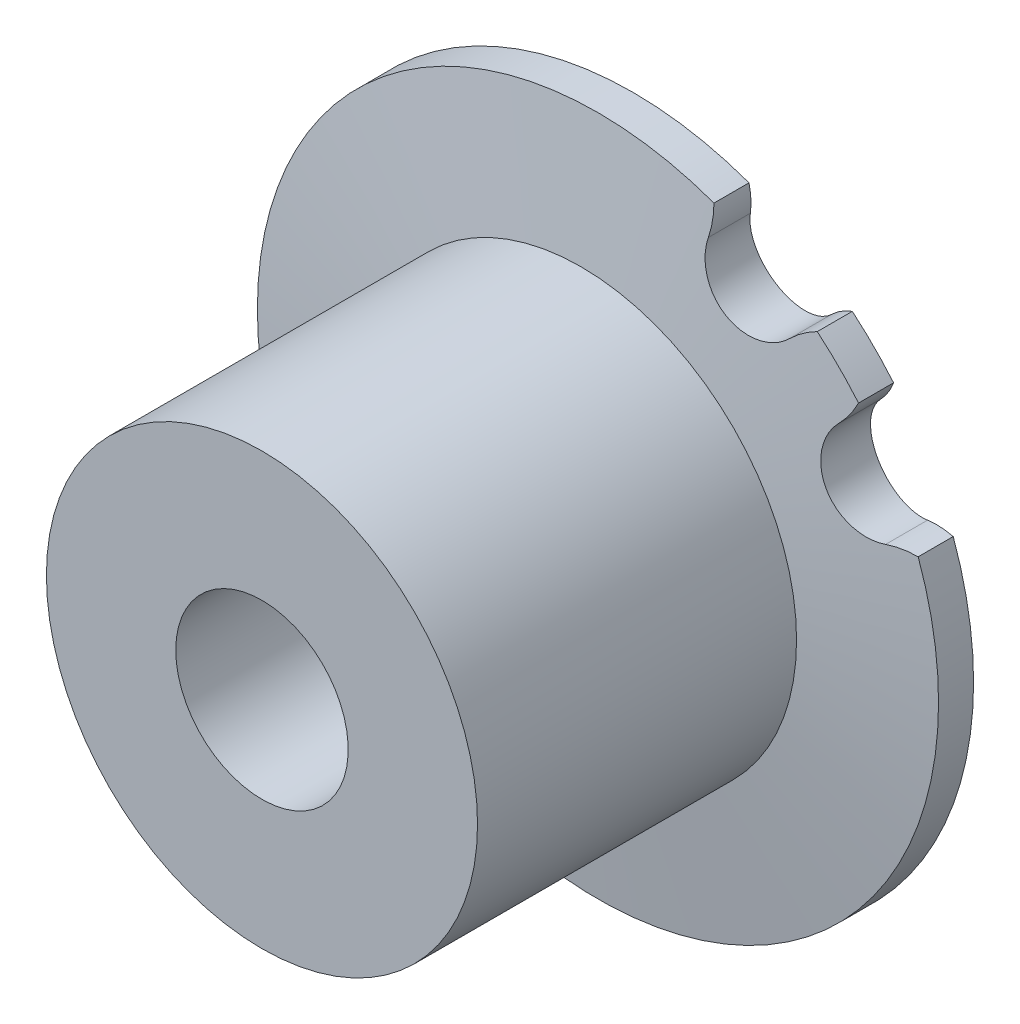
ISO-10303-21;
HEADER;
FILE_DESCRIPTION(('STEP AP214'),'2;1');
FILE_NAME('part.step','',(''),(''),'','','');
FILE_SCHEMA(('AUTOMOTIVE_DESIGN { 1 0 10303 214 1 1 1 1 }'));
ENDSEC;
DATA;
#1=APPLICATION_CONTEXT('core data for automotive mechanical design processes');
#2=APPLICATION_PROTOCOL_DEFINITION('international standard','automotive_design',2000,#1);
#3=PRODUCT_CONTEXT('',#1,'mechanical');
#4=PRODUCT('Part','Part','',(#3));
#5=PRODUCT_RELATED_PRODUCT_CATEGORY('part','',(#4));
#6=PRODUCT_DEFINITION_FORMATION('','',#4);
#7=PRODUCT_DEFINITION_CONTEXT('part definition',#1,'design');
#8=PRODUCT_DEFINITION('design','',#6,#7);
#9=PRODUCT_DEFINITION_SHAPE('','',#8);
#10=(LENGTH_UNIT() NAMED_UNIT(*) SI_UNIT(.MILLI.,.METRE.));
#11=(NAMED_UNIT(*) PLANE_ANGLE_UNIT() SI_UNIT($,.RADIAN.));
#12=(NAMED_UNIT(*) SI_UNIT($,.STERADIAN.) SOLID_ANGLE_UNIT());
#13=UNCERTAINTY_MEASURE_WITH_UNIT(LENGTH_MEASURE(1.E-05),#10,'distance_accuracy_value','');
#14=(GEOMETRIC_REPRESENTATION_CONTEXT(3) GLOBAL_UNCERTAINTY_ASSIGNED_CONTEXT((#13)) GLOBAL_UNIT_ASSIGNED_CONTEXT((#10,
#11,#12)) REPRESENTATION_CONTEXT('',''));
#15=CARTESIAN_POINT('',(0.,0.,0.));
#16=DIRECTION('',(0.,0.,1.));
#17=DIRECTION('',(1.,0.,0.));
#18=AXIS2_PLACEMENT_3D('',#15,#16,#17);
#19=CARTESIAN_POINT('',(0.,0.,-0.406300000015847));
#20=DIRECTION('',(0.,0.,1.));
#21=DIRECTION('',(1.,0.,0.));
#22=AXIS2_PLACEMENT_3D('',#19,#20,#21);
#23=CONICAL_SURFACE('',#22,7.89999999989277,1.44742606851384);
#24=CARTESIAN_POINT('',(0.,0.,-0.799999999998249));
#25=DIRECTION('',(0.,0.,1.));
#26=DIRECTION('',(1.,0.,0.));
#27=AXIS2_PLACEMENT_3D('',#24,#25,#26);
#28=CIRCLE('',#27,4.72500000000764);
#29=CARTESIAN_POINT('',(4.72500000000764,0.,-0.799999999998249));
#30=VERTEX_POINT('',#29);
#31=EDGE_CURVE('E20',#30,#30,#28,.F.);
#32=ORIENTED_EDGE('',*,*,#31,.F.);
#33=EDGE_LOOP('',(#32));
#34=FACE_BOUND('',#33,.T.);
#35=CARTESIAN_POINT('',(5.6633878781362,4.52642659741511,-0.486900000001804));
#36=CARTESIAN_POINT('',(5.70323999846953,4.5671311185864,-0.479888063827677));
#37=CARTESIAN_POINT('',(5.74126707334079,4.60962740082457,-0.472913935650916));
#38=CARTESIAN_POINT('',(5.81311095166015,4.69750934307928,-0.459140365734118));
#39=CARTESIAN_POINT('',(5.84695814458696,4.74287001497894,-0.452339988251805));
#40=CARTESIAN_POINT('',(5.91050928654359,4.83642972753544,-0.438902715557868));
#41=CARTESIAN_POINT('',(5.94021321995522,4.88462877889068,-0.432265820962577));
#42=CARTESIAN_POINT('',(5.99546470193269,4.98387422662841,-0.419143816616671));
#43=CARTESIAN_POINT('',(6.02097791788618,5.03493994774833,-0.412660300416595));
#44=CARTESIAN_POINT('',(6.04415414406782,5.08706208756621,-0.406300000002506));
#45=B_SPLINE_CURVE_WITH_KNOTS('',3,(#35,#36,#37,#38,#39,#40,#41,#42,#43,#44),.UNSPECIFIED.,.F.,
.F.,(4,2,2,2,4),(0.,0.172127752811509,0.342919429481872,0.513711749940532,0.685840154805954),.UNSPECIFIED.);
#46=CARTESIAN_POINT('',(5.6633878781361,4.52642659741506,-0.486900000001818));
#47=VERTEX_POINT('',#46);
#48=CARTESIAN_POINT('',(6.04415414406777,5.08706208756599,-0.406300000001253));
#49=VERTEX_POINT('',#48);
#50=EDGE_CURVE('E80',#47,#49,#45,.T.);
#51=ORIENTED_EDGE('',*,*,#50,.F.);
#52=CARTESIAN_POINT('',(5.66338787813615,4.52642659741516,-0.486900000001805));
#53=CARTESIAN_POINT('',(5.64106908345087,4.50362480164492,-0.490826971491648));
#54=CARTESIAN_POINT('',(5.61972496788327,4.479886647493,-0.494731978562252));
#55=CARTESIAN_POINT('',(5.57911462825524,4.43068513857594,-0.502471196304209));
#56=CARTESIAN_POINT('',(5.55984835940556,4.405221821017,-0.506305408500109));
#57=CARTESIAN_POINT('',(5.50540408316676,4.32653084448629,-0.517652146114848));
#58=CARTESIAN_POINT('',(5.47352300338086,4.27094321742129,-0.525018930336247));
#59=CARTESIAN_POINT('',(5.4195726257452,4.15511003334002,-0.539098441301466));
#60=CARTESIAN_POINT('',(5.39750914359883,4.09486174019644,-0.545810778533634));
#61=CARTESIAN_POINT('',(5.36386781321658,3.97142311008421,-0.558328968240294));
#62=CARTESIAN_POINT('',(5.35228689807333,3.90823363931469,-0.564135085437864));
#63=CARTESIAN_POINT('',(5.34001835123204,3.78104437235032,-0.574577910765766));
#64=CARTESIAN_POINT('',(5.33927453412871,3.71705047854365,-0.579220527741208));
#65=CARTESIAN_POINT('',(5.34860210394144,3.5897601057086,-0.587173601503889));
#66=CARTESIAN_POINT('',(5.35867473820345,3.52646370796548,-0.590483904589051));
#67=CARTESIAN_POINT('',(5.38923544126265,3.40301282291811,-0.595593071437972));
#68=CARTESIAN_POINT('',(5.40962381545149,3.34283422942947,-0.597405973121782));
#69=CARTESIAN_POINT('',(5.46019479298879,3.22672131385841,-0.599486547856637));
#70=CARTESIAN_POINT('',(5.4903762017454,3.17078647513282,-0.599754409302813));
#71=CARTESIAN_POINT('',(5.55944299822654,3.0651095360881,-0.598735744300202));
#72=CARTESIAN_POINT('',(5.59827118137945,3.01532993501737,-0.597459199808859));
#73=CARTESIAN_POINT('',(5.68362750239605,2.92294757754351,-0.593428926647428));
#74=CARTESIAN_POINT('',(5.73015596184563,2.88034512102876,-0.590675136272494));
#75=CARTESIAN_POINT('',(5.82962764216104,2.80345994815858,-0.583813113193446));
#76=CARTESIAN_POINT('',(5.8825773190042,2.76918571082534,-0.579703510076385));
#77=CARTESIAN_POINT('',(5.99335075149926,2.70993684033974,-0.570308973098324));
#78=CARTESIAN_POINT('',(6.05117466964725,2.6849625173758,-0.565024000043541));
#79=CARTESIAN_POINT('',(6.17053899409961,2.6448070343283,-0.553447547440831));
#80=CARTESIAN_POINT('',(6.23210506683476,2.6297044900137,-0.547148474316703));
#81=CARTESIAN_POINT('',(6.35681286108793,2.6099918814189,-0.533811275473411));
#82=CARTESIAN_POINT('',(6.41995411907639,2.60537876639211,-0.526773365260846));
#83=CARTESIAN_POINT('',(6.52832157883779,2.60653280529242,-0.514252124740415));
#84=CARTESIAN_POINT('',(6.57360523712539,2.60975136753019,-0.508886444683556));
#85=CARTESIAN_POINT('',(6.66337912105328,2.62157563776894,-0.497994338960198));
#86=CARTESIAN_POINT('',(6.70787035927045,2.6301738740618,-0.492468146360107));
#87=CARTESIAN_POINT('',(6.75169436079519,2.64142447524316,-0.486900000001803));
#88=B_SPLINE_CURVE_WITH_KNOTS('',3,(#52,#53,#54,#55,#56,#57,#58,#59,#60,#61,#62,#63,#64,#65,#66,
#67,#68,#69,#70,#71,#72,#73,#74,#75,#76,#77,#78,#79,#80,#81,#82,#83,#84,#85,#86,#87),
.UNSPECIFIED.,.F.,.F.,(4,2,2,2,2,2,2,2,2,2,2,2,2,2,2,2,2,4),(0.,0.0963841737467203,
0.192766269459475,0.385284494191656,0.577916610655706,0.770492350089633,0.962069314849387,
1.15366837450968,1.34345015276673,1.53320878941357,1.72174748382223,1.91029405414188,
2.09903178829932,2.28777581703264,2.47800520095799,2.66817925147085,2.80501223148445,
2.94165558783532),.UNSPECIFIED.);
#89=CARTESIAN_POINT('',(6.75169436079512,2.6414244752434,-0.486900000001799));
#90=VERTEX_POINT('',#89);
#91=EDGE_CURVE('E83',#47,#90,#88,.T.);
#92=ORIENTED_EDGE('',*,*,#91,.T.);
#93=CARTESIAN_POINT('',(7.42760207049504,2.69085998936904,-0.406300000002477));
#94=CARTESIAN_POINT('',(7.37087486022232,2.69684985864082,-0.412660300416569));
#95=CARTESIAN_POINT('',(7.31389404049314,2.70028762605283,-0.419143816616645));
#96=CARTESIAN_POINT('',(7.20031922055354,2.70206116293247,-0.432265820962555));
#97=CARTESIAN_POINT('',(7.14372565093575,2.70043632768329,-0.438902715557847));
#98=CARTESIAN_POINT('',(7.03092499211271,2.69217928058759,-0.452339988251787));
#99=CARTESIAN_POINT('',(6.97471790145145,2.68554708761601,-0.459140365734102));
#100=CARTESIAN_POINT('',(6.86268796776525,2.66726943501239,-0.472913935650904));
#101=CARTESIAN_POINT('',(6.80687157034496,2.65558516326134,-0.479888063827667));
#102=CARTESIAN_POINT('',(6.75169436079506,2.64142447524365,-0.486900000001795));
#103=B_SPLINE_CURVE_WITH_KNOTS('',3,(#93,#94,#95,#96,#97,#98,#99,#100,#101,#102),.UNSPECIFIED.,
.F.,.F.,(4,2,2,2,4),(0.,0.172128404865465,0.342920725324174,0.513712401994581,
0.685840154806138),.UNSPECIFIED.);
#104=CARTESIAN_POINT('',(7.42760207049476,2.69085998936893,-0.406300000001239));
#105=VERTEX_POINT('',#104);
#106=EDGE_CURVE('E98',#105,#90,#103,.T.);
#107=ORIENTED_EDGE('',*,*,#106,.F.);
#108=CARTESIAN_POINT('',(0.,0.,-0.4063));
#109=DIRECTION('',(0.,0.,-1.));
#110=DIRECTION('',(-1.,0.,0.));
#111=AXIS2_PLACEMENT_3D('',#108,#109,#110);
#112=CIRCLE('',#111,7.9);
#113=CARTESIAN_POINT('',(2.69085998936893,7.42760207049476,-0.406300000001239));
#114=VERTEX_POINT('',#113);
#115=EDGE_CURVE('E217',#114,#105,#112,.F.);
#116=ORIENTED_EDGE('',*,*,#115,.F.);
#117=CARTESIAN_POINT('',(2.64142447524365,6.75169436079506,-0.486900000001795));
#118=CARTESIAN_POINT('',(2.65558516326135,6.80687157034496,-0.479888063827667));
#119=CARTESIAN_POINT('',(2.66726943501239,6.86268796776525,-0.472913935650904));
#120=CARTESIAN_POINT('',(2.68554708761601,6.97471790145145,-0.459140365734102));
#121=CARTESIAN_POINT('',(2.69217928058759,7.03092499211271,-0.452339988251787));
#122=CARTESIAN_POINT('',(2.70043632768329,7.14372565093575,-0.438902715557847));
#123=CARTESIAN_POINT('',(2.70206116293247,7.20031922055354,-0.432265820962555));
#124=CARTESIAN_POINT('',(2.70028762605283,7.31389404049314,-0.419143816616645));
#125=CARTESIAN_POINT('',(2.69684985864082,7.37087486022232,-0.412660300416569));
#126=CARTESIAN_POINT('',(2.69085998936904,7.42760207049504,-0.406300000002478));
#127=B_SPLINE_CURVE_WITH_KNOTS('',3,(#117,#118,#119,#120,#121,#122,#123,#124,#125,#126),
.UNSPECIFIED.,.F.,.F.,(4,2,2,2,4),(0.,0.172127752811555,0.342919429481962,0.513711749940671,
0.685840154806136),.UNSPECIFIED.);
#128=CARTESIAN_POINT('',(2.6414244752434,6.75169436079513,-0.486900000001799));
#129=VERTEX_POINT('',#128);
#130=EDGE_CURVE('E101',#129,#114,#127,.T.);
#131=ORIENTED_EDGE('',*,*,#130,.F.);
#132=CARTESIAN_POINT('',(2.64142447524316,6.75169436079519,-0.486900000001803));
#133=CARTESIAN_POINT('',(2.63349672994898,6.72078802906361,-0.490826971491646));
#134=CARTESIAN_POINT('',(2.62688126072209,6.6895581267453,-0.494731978562251));
#135=CARTESIAN_POINT('',(2.61631242940642,6.62664320030458,-0.502471196304207));
#136=CARTESIAN_POINT('',(2.61235900992593,6.59495818600907,-0.506305408500107));
#137=CARTESIAN_POINT('',(2.60455437187783,6.49958766316547,-0.517652146114846));
#138=CARTESIAN_POINT('',(2.60473836041566,6.43550682609813,-0.525018930336245));
#139=CARTESIAN_POINT('',(2.61593255488004,6.30821715726469,-0.539098441301464));
#140=CARTESIAN_POINT('',(2.62694916541714,6.24500886379451,-0.545810778533633));
#141=CARTESIAN_POINT('',(2.65953423374512,6.12128720911784,-0.558328968240292));
#142=CARTESIAN_POINT('',(2.68109960241674,6.06077306460812,-0.564135085437863));
#143=CARTESIAN_POINT('',(2.73406936266685,5.94448965490761,-0.574577910765765));
#144=CARTESIAN_POINT('',(2.76542214506294,5.88869740863228,-0.579220527741206));
#145=CARTESIAN_POINT('',(2.83714524389386,5.7831244970063,-0.587173601503888));
#146=CARTESIAN_POINT('',(2.87751659991934,5.73334452572372,-0.59048390458905));
#147=CARTESIAN_POINT('',(2.96570838764981,5.64171327468262,-0.595593071437972));
#148=CARTESIAN_POINT('',(3.01345453438353,5.59979127105186,-0.597405973121781));
#149=CARTESIAN_POINT('',(3.11530674341057,5.5245200252285,-0.599486547856636));
#150=CARTESIAN_POINT('',(3.16941202947859,5.49116973831386,-0.599754409302813));
#151=CARTESIAN_POINT('',(3.28206409931163,5.43418422274752,-0.598735744300203));
#152=CARTESIAN_POINT('',(3.3405800928402,5.41048791520647,-0.597459199808859));
#153=CARTESIAN_POINT('',(3.4606920139511,5.3731606072809,-0.593428926647429));
#154=CARTESIAN_POINT('',(3.52228807009075,5.3595300274003,-0.590675136272495));
#155=CARTESIAN_POINT('',(3.64687565863612,5.34268135467807,-0.583813113193447));
#156=CARTESIAN_POINT('',(3.70986854257109,5.33947383287373,-0.579703510076386));
#157=CARTESIAN_POINT('',(3.83542558441901,5.34354952213519,-0.570308973098325));
#158=CARTESIAN_POINT('',(3.89798972796349,5.35083308308009,-0.565024000043542));
#159=CARTESIAN_POINT('',(4.02144000676855,5.37573957688591,-0.553447547440833));
#160=CARTESIAN_POINT('',(4.08230906192573,5.39344342621525,-0.547148474316704));
#161=CARTESIAN_POINT('',(4.2001654840963,5.43872570352389,-0.533811275473413));
#162=CARTESIAN_POINT('',(4.25715397505461,5.46630125771433,-0.526773365260847));
#163=CARTESIAN_POINT('',(4.35042592870142,5.52148441459966,-0.514252124740417));
#164=CARTESIAN_POINT('',(4.38803344603589,5.54691360040503,-0.508886444683558));
#165=CARTESIAN_POINT('',(4.45986777499447,5.60204066077694,-0.4979943389602));
#166=CARTESIAN_POINT('',(4.49409919938993,5.63173257094288,-0.492468146360109));
#167=CARTESIAN_POINT('',(4.52642659741516,5.66338787813615,-0.486900000001805));
#168=B_SPLINE_CURVE_WITH_KNOTS('',3,(#132,#133,#134,#135,#136,#137,#138,#139,#140,#141,#142,
#143,#144,#145,#146,#147,#148,#149,#150,#151,#152,#153,#154,#155,#156,#157,#158,#159,#160,#161,
#162,#163,#164,#165,#166,#167),.UNSPECIFIED.,.F.,.F.,(4,2,2,2,2,2,2,2,2,2,2,2,2,2,2,2,2,4),(0.,
0.0963841737467204,0.192766269459476,0.385284494191656,0.577916610655706,0.770492350089633,
0.962069314849388,1.15366837450969,1.34345015276673,1.53320878941357,1.72174748382223,
1.91029405414188,2.09903178829932,2.28777581703264,2.47800520095799,2.66817925147085,
2.80501223148445,2.94165558783531),.UNSPECIFIED.);
#169=CARTESIAN_POINT('',(4.52642659741514,5.66338787813618,-0.486900000001804));
#170=VERTEX_POINT('',#169);
#171=EDGE_CURVE('E181',#129,#170,#168,.T.);
#172=ORIENTED_EDGE('',*,*,#171,.T.);
#173=CARTESIAN_POINT('',(5.08706208756628,6.04415414406786,-0.406300000002497));
#174=CARTESIAN_POINT('',(5.0349399477484,6.02097791788621,-0.412660300416587));
#175=CARTESIAN_POINT('',(4.98387422662847,5.99546470193272,-0.419143816616663));
#176=CARTESIAN_POINT('',(4.88462877889073,5.94021321995525,-0.432265820962571));
#177=CARTESIAN_POINT('',(4.83642972753548,5.91050928654361,-0.438902715557863));
#178=CARTESIAN_POINT('',(4.74287001497897,5.84695814458698,-0.452339988251801));
#179=CARTESIAN_POINT('',(4.6975093430793,5.81311095166017,-0.459140365734115));
#180=CARTESIAN_POINT('',(4.60962740082458,5.7412670733408,-0.472913935650915));
#181=CARTESIAN_POINT('',(4.56713111858641,5.70323999846953,-0.479888063827677));
#182=CARTESIAN_POINT('',(4.52642659741511,5.6633878781362,-0.486900000001804));
#183=B_SPLINE_CURVE_WITH_KNOTS('',3,(#173,#174,#175,#176,#177,#178,#179,#180,#181,#182),
.UNSPECIFIED.,.F.,.F.,(4,2,2,2,4),(0.,0.172128404865439,0.342920725324124,0.513712401994508,
0.685840154806037),.UNSPECIFIED.);
#184=CARTESIAN_POINT('',(5.08706208756606,6.04415414406776,-0.406300000001248));
#185=VERTEX_POINT('',#184);
#186=EDGE_CURVE('E187',#185,#170,#183,.T.);
#187=ORIENTED_EDGE('',*,*,#186,.F.);
#188=CARTESIAN_POINT('',(0.,0.,-0.4063));
#189=DIRECTION('',(0.,0.,-1.));
#190=DIRECTION('',(-1.,0.,0.));
#191=AXIS2_PLACEMENT_3D('',#188,#189,#190);
#192=CIRCLE('',#191,7.9);
#193=EDGE_CURVE('E85',#49,#185,#192,.F.);
#194=ORIENTED_EDGE('',*,*,#193,.F.);
#195=EDGE_LOOP('',(#51,#92,#107,#116,#131,#172,#187,#194));
#196=FACE_BOUND('',#195,.T.);
#197=ADVANCED_FACE('F16',(#34,#196),#23,.T.);
#198=CARTESIAN_POINT('',(0.,0.,-0.8));
#199=DIRECTION('',(0.,0.,-1.));
#200=DIRECTION('',(-1.,0.,0.));
#201=AXIS2_PLACEMENT_3D('',#198,#199,#200);
#202=PLANE('',#201);
#203=CARTESIAN_POINT('',(0.,0.,-0.8));
#204=DIRECTION('',(0.,0.,-1.));
#205=DIRECTION('',(-1.,0.,0.));
#206=AXIS2_PLACEMENT_3D('',#203,#204,#205);
#207=CIRCLE('',#206,2.);
#208=CARTESIAN_POINT('',(-2.,0.,-0.8));
#209=VERTEX_POINT('',#208);
#210=EDGE_CURVE('E108',#209,#209,#207,.F.);
#211=ORIENTED_EDGE('',*,*,#210,.T.);
#212=EDGE_LOOP('',(#211));
#213=FACE_BOUND('',#212,.T.);
#214=ORIENTED_EDGE('',*,*,#31,.T.);
#215=EDGE_LOOP('',(#214));
#216=FACE_BOUND('',#215,.T.);
#217=ADVANCED_FACE('F203',(#213,#216),#202,.T.);
#218=CARTESIAN_POINT('',(4.296485203779,5.864404644522,9.1));
#219=DIRECTION('',(0.,0.,1.));
#220=DIRECTION('',(1.,0.,0.));
#221=AXIS2_PLACEMENT_3D('',#218,#219,#220);
#222=CYLINDRICAL_SURFACE('',#221,1.912748853275);
#223=DIRECTION('',(0.,0.,1.));
#224=VECTOR('',#223,1.);
#225=CARTESIAN_POINT('',(5.663387878136,4.526426597415,9.1));
#226=LINE('',#225,#224);
#227=CARTESIAN_POINT('',(5.66338795331864,4.52642667422292,0.487059041894197));
#228=VERTEX_POINT('',#227);
#229=EDGE_CURVE('E89',#228,#47,#226,.F.);
#230=ORIENTED_EDGE('',*,*,#229,.T.);
#231=ORIENTED_EDGE('',*,*,#50,.T.);
#232=DIRECTION('',(0.,0.,-1.));
#233=VECTOR('',#232,1.);
#234=CARTESIAN_POINT('',(6.04415414406772,5.08706208756577,8.65));
#235=LINE('',#234,#233);
#236=CARTESIAN_POINT('',(6.04415414406915,5.08706208756908,0.406499999997359));
#237=VERTEX_POINT('',#236);
#238=EDGE_CURVE('E231',#237,#49,#235,.T.);
#239=ORIENTED_EDGE('',*,*,#238,.F.);
#240=CARTESIAN_POINT('',(5.66338802850128,4.52642675103083,0.48705902867219));
#241=CARTESIAN_POINT('',(5.70324015658535,4.56713128882251,0.480050652531425));
#242=CARTESIAN_POINT('',(5.74126723395961,4.60962758540833,0.473080065857144));
#243=CARTESIAN_POINT('',(5.81311110359416,4.69750954070697,0.459313492730647));
#244=CARTESIAN_POINT('',(5.84695828578498,4.74287021108461,0.452516570985646));
#245=CARTESIAN_POINT('',(5.91050939708898,4.83642990204518,0.439086129040634));
#246=CARTESIAN_POINT('',(5.94021331059941,4.88462893331585,0.432452609456043));
#247=CARTESIAN_POINT('',(5.99546474985894,4.98387432119242,0.419337279879443));
#248=CARTESIAN_POINT('',(6.02097794252597,5.03494000258592,0.412857062667525));
#249=CARTESIAN_POINT('',(6.04415414406885,5.08706208756852,0.406499999997523));
#250=B_SPLINE_CURVE_WITH_KNOTS('',3,(#240,#241,#242,#243,#244,#245,#246,#247,#248,#249),
.UNSPECIFIED.,.F.,.F.,(4,2,2,2,4),(0.,0.172126498838116,0.342916914831207,0.513707973970822,
0.685835124212785),.UNSPECIFIED.);
#251=EDGE_CURVE('E92',#228,#237,#250,.T.);
#252=ORIENTED_EDGE('',*,*,#251,.F.);
#253=EDGE_LOOP('',(#230,#231,#239,#252));
#254=FACE_BOUND('',#253,.T.);
#255=ADVANCED_FACE('F90',(#254),#222,.T.);
#256=CARTESIAN_POINT('',(0.,0.,8.65));
#257=DIRECTION('',(0.,0.,-1.));
#258=DIRECTION('',(-1.,0.,0.));
#259=AXIS2_PLACEMENT_3D('',#256,#257,#258);
#260=CYLINDRICAL_SURFACE('',#259,7.9);
#261=CARTESIAN_POINT('',(0.,0.,0.406499999996868));
#262=DIRECTION('',(0.,0.,-1.));
#263=DIRECTION('',(0.,-1.,0.));
#264=AXIS2_PLACEMENT_3D('',#261,#262,#263);
#265=CIRCLE('',#264,7.90000000000646);
#266=CARTESIAN_POINT('',(5.08706208756731,6.04415414406831,0.406499999997196));
#267=VERTEX_POINT('',#266);
#268=EDGE_CURVE('E208',#237,#267,#265,.F.);
#269=ORIENTED_EDGE('',*,*,#268,.F.);
#270=ORIENTED_EDGE('',*,*,#238,.T.);
#271=ORIENTED_EDGE('',*,*,#193,.T.);
#272=DIRECTION('',(0.,0.,1.));
#273=VECTOR('',#272,1.);
#274=CARTESIAN_POINT('',(5.0870620875661,6.04415414406778,9.1));
#275=LINE('',#274,#273);
#276=EDGE_CURVE('E195',#267,#185,#275,.F.);
#277=ORIENTED_EDGE('',*,*,#276,.F.);
#278=EDGE_LOOP('',(#269,#270,#271,#277));
#279=FACE_BOUND('',#278,.T.);
#280=ADVANCED_FACE('F202',(#279),#260,.T.);
#281=CARTESIAN_POINT('',(5.864404644522,4.296485203779,9.1));
#282=DIRECTION('',(0.,0.,1.));
#283=DIRECTION('',(1.,0.,0.));
#284=AXIS2_PLACEMENT_3D('',#281,#282,#283);
#285=CYLINDRICAL_SURFACE('',#284,1.912748853275);
#286=ORIENTED_EDGE('',*,*,#276,.T.);
#287=ORIENTED_EDGE('',*,*,#186,.T.);
#288=DIRECTION('',(0.,0.,1.));
#289=VECTOR('',#288,1.);
#290=CARTESIAN_POINT('',(4.526426597415,5.663387878136,9.1));
#291=LINE('',#290,#289);
#292=CARTESIAN_POINT('',(4.52642667437033,5.66338795346291,0.487059041868823));
#293=VERTEX_POINT('',#292);
#294=EDGE_CURVE('E186',#170,#293,#291,.T.);
#295=ORIENTED_EDGE('',*,*,#294,.T.);
#296=CARTESIAN_POINT('',(5.08706208756851,6.04415414406885,0.406499999997524));
#297=CARTESIAN_POINT('',(5.03494000261775,6.0209779425401,0.412857062663646));
#298=CARTESIAN_POINT('',(4.98387432125478,5.99546474989009,0.419337279871532));
#299=CARTESIAN_POINT('',(4.88462893343529,5.94021331066944,0.432452609439934));
#300=CARTESIAN_POINT('',(4.83642990219122,5.9105093971808,0.439086129020363));
#301=CARTESIAN_POINT('',(4.74287021128,5.84695828592507,0.452516570956905));
#302=CARTESIAN_POINT('',(4.6975095409251,5.81311110376073,0.459313492697598));
#303=CARTESIAN_POINT('',(4.60962758566809,5.74126723418383,0.47308006581532));
#304=CARTESIAN_POINT('',(4.56713128910109,5.70324015684082,0.480050652485132));
#305=CARTESIAN_POINT('',(4.52642675132564,5.66338802878986,0.48705902862144));
#306=B_SPLINE_CURVE_WITH_KNOTS('',3,(#296,#297,#298,#299,#300,#301,#302,#303,#304,#305),
.UNSPECIFIED.,.F.,.F.,(4,2,2,2,4),(0.,0.172127150136941,0.34291820917395,0.51370862506444,
0.685835123797536),.UNSPECIFIED.);
#307=EDGE_CURVE('E151',#267,#293,#306,.T.);
#308=ORIENTED_EDGE('',*,*,#307,.F.);
#309=EDGE_LOOP('',(#286,#287,#295,#308));
#310=FACE_BOUND('',#309,.T.);
#311=ADVANCED_FACE('F174',(#310),#285,.T.);
#312=CARTESIAN_POINT('',(3.735985557211,6.470916801433,9.1));
#313=DIRECTION('',(0.,0.,1.));
#314=DIRECTION('',(1.,0.,0.));
#315=AXIS2_PLACEMENT_3D('',#312,#313,#314);
#316=CYLINDRICAL_SURFACE('',#315,1.13);
#317=CARTESIAN_POINT('',(4.52642675132566,5.66338802878983,0.48705902862144));
#318=CARTESIAN_POINT('',(4.50362504456466,5.64106931251347,0.490983990731745));
#319=CARTESIAN_POINT('',(4.47988698790809,5.61972527004164,0.494886999437372));
#320=CARTESIAN_POINT('',(4.43068569379693,5.5791150653211,0.502622256016191));
#321=CARTESIAN_POINT('',(4.40522249359382,5.55984885822842,0.506454505415035));
#322=CARTESIAN_POINT('',(4.32653191803493,5.50540475923165,0.517795430965342));
#323=CARTESIAN_POINT('',(4.27094460868532,5.47352377243228,0.52515843963594));
#324=CARTESIAN_POINT('',(4.15511216996827,5.41957349961131,0.539230732337665));
#325=CARTESIAN_POINT('',(4.09486430512944,5.39751002797745,0.545939627140621));
#326=CARTESIAN_POINT('',(3.97142662696642,5.36386858653048,0.558451400658534));
#327=CARTESIAN_POINT('',(3.90823767952606,5.35228755085948,0.564254543872632));
#328=CARTESIAN_POINT('',(3.78104918690162,5.34001855389179,0.574692059784667));
#329=CARTESIAN_POINT('',(3.71705553770091,5.33927446563038,0.579332332193961));
#330=CARTESIAN_POINT('',(3.58976568126773,5.34860139319748,0.587281405134088));
#331=CARTESIAN_POINT('',(3.52646955535486,5.35867365683415,0.590590051983892));
#332=CARTESIAN_POINT('',(3.40301859097687,5.38923365066239,0.595696716440953));
#333=CARTESIAN_POINT('',(3.34283967069154,5.40962178694625,0.597508750650145));
#334=CARTESIAN_POINT('',(3.22672610328657,5.46019236579663,0.599588366088623));
#335=CARTESIAN_POINT('',(3.17079093972124,5.49037361421993,0.599856135546305));
#336=CARTESIAN_POINT('',(3.06511299943951,5.5594404064449,0.598838061578568));
#337=CARTESIAN_POINT('',(3.01533275935051,5.59826880196147,0.597562185189638));
#338=CARTESIAN_POINT('',(2.92294921462196,5.68362575971269,0.593533965047793));
#339=CARTESIAN_POINT('',(2.88034620987876,5.73015464354654,0.590781559619119));
#340=CARTESIAN_POINT('',(2.80346012028968,5.82962732894428,0.583922962742949));
#341=CARTESIAN_POINT('',(2.76918550508518,5.88257757945272,0.579815403080326));
#342=CARTESIAN_POINT('',(2.70993605544065,5.99335234318132,0.570425517205646));
#343=CARTESIAN_POINT('',(2.68496153097152,6.05117701878672,0.565143151846826));
#344=CARTESIAN_POINT('',(2.64480603721121,6.1705425458724,0.553572440470287));
#345=CARTESIAN_POINT('',(2.62970360825067,6.23210903964073,0.547276511968472));
#346=CARTESIAN_POINT('',(2.60999136529259,6.35681773037292,0.533945965635608));
#347=CARTESIAN_POINT('',(2.60537849923614,6.41995946359565,0.526911563295367));
#348=CARTESIAN_POINT('',(2.60653309003946,6.52832639795799,0.514396716991982));
#349=CARTESIAN_POINT('',(2.609751754985,6.57360906039287,0.509033872446234));
#350=CARTESIAN_POINT('',(2.62157600070597,6.66338099434962,0.498147525574393));
#351=CARTESIAN_POINT('',(2.63017411040612,6.70787127835353,0.49262425617732));
#352=CARTESIAN_POINT('',(2.64142447524293,6.75169436079432,0.487059055116286));
#353=B_SPLINE_CURVE_WITH_KNOTS('',3,(#317,#318,#319,#320,#321,#322,#323,#324,#325,#326,#327,
#328,#329,#330,#331,#332,#333,#334,#335,#336,#337,#338,#339,#340,#341,#342,#343,#344,#345,#346,
#347,#348,#349,#350,#351,#352),.UNSPECIFIED.,.F.,.F.,(4,2,2,2,2,2,2,2,2,2,2,2,2,2,2,2,2,4),(0.,
0.0963830850779007,0.192764089593183,0.385280072034465,0.577909920104485,0.770483410400833,
0.962059162904931,1.15365701856107,1.34343942820388,1.53319870502996,1.72173925255343,
1.91028767617457,2.09902705100534,2.2877727159338,2.47800229369148,2.66817651488076,
2.80500557867516,2.94164503220673),.UNSPECIFIED.);
#354=CARTESIAN_POINT('',(2.64142447524351,6.75169436079452,0.487059055116237));
#355=VERTEX_POINT('',#354);
#356=EDGE_CURVE('E164',#293,#355,#353,.T.);
#357=ORIENTED_EDGE('',*,*,#356,.F.);
#358=ORIENTED_EDGE('',*,*,#294,.F.);
#359=ORIENTED_EDGE('',*,*,#171,.F.);
#360=DIRECTION('',(0.,0.,1.));
#361=VECTOR('',#360,1.);
#362=CARTESIAN_POINT('',(2.64142447524359,6.75169436079485,9.1));
#363=LINE('',#362,#361);
#364=EDGE_CURVE('E226',#355,#129,#363,.F.);
#365=ORIENTED_EDGE('',*,*,#364,.F.);
#366=EDGE_LOOP('',(#357,#358,#359,#365));
#367=FACE_BOUND('',#366,.T.);
#368=ADVANCED_FACE('F170',(#367),#316,.F.);
#369=CARTESIAN_POINT('',(0.788663011196,7.226966002117,9.1));
#370=DIRECTION('',(0.,0.,1.));
#371=DIRECTION('',(1.,0.,0.));
#372=AXIS2_PLACEMENT_3D('',#369,#370,#371);
#373=CYLINDRICAL_SURFACE('',#372,1.912748853275);
#374=ORIENTED_EDGE('',*,*,#364,.T.);
#375=ORIENTED_EDGE('',*,*,#130,.T.);
#376=DIRECTION('',(0.,0.,-1.));
#377=VECTOR('',#376,1.);
#378=CARTESIAN_POINT('',(2.69085998936882,7.42760207049449,8.65));
#379=LINE('',#378,#377);
#380=CARTESIAN_POINT('',(2.69085998936858,7.42760207049801,0.406499999997358));
#381=VERTEX_POINT('',#380);
#382=EDGE_CURVE('E95',#381,#114,#379,.T.);
#383=ORIENTED_EDGE('',*,*,#382,.F.);
#384=CARTESIAN_POINT('',(2.64142447524342,6.75169436079419,0.487059055116278));
#385=CARTESIAN_POINT('',(2.65558517237226,6.80687160456316,0.480050676653406));
#386=CARTESIAN_POINT('',(2.66726944831444,6.86268803229256,0.473080087650473));
#387=CARTESIAN_POINT('',(2.68554710204547,6.97471800673742,0.459313509951409));
#388=CARTESIAN_POINT('',(2.69217929250207,7.03092510787377,0.452516585961654));
#389=CARTESIAN_POINT('',(2.70043633277599,7.14372576751142,0.439086139603329));
#390=CARTESIAN_POINT('',(2.70206116373705,7.20031932746721,0.432452617850178));
#391=CARTESIAN_POINT('',(2.7002876224676,7.31389411009614,0.419337284002216));
#392=CARTESIAN_POINT('',(2.69684985447246,7.37087490198581,0.4128570646894));
#393=CARTESIAN_POINT('',(2.69085998936878,7.42760207049751,0.406499999997499));
#394=B_SPLINE_CURVE_WITH_KNOTS('',3,(#384,#385,#386,#387,#388,#389,#390,#391,#392,#393),
.UNSPECIFIED.,.F.,.F.,(4,2,2,2,4),(0.,0.172126553559888,0.342917023014963,0.513708135617272,
0.685835340581733),.UNSPECIFIED.);
#395=EDGE_CURVE('E160',#355,#381,#394,.T.);
#396=ORIENTED_EDGE('',*,*,#395,.F.);
#397=EDGE_LOOP('',(#374,#375,#383,#396));
#398=FACE_BOUND('',#397,.T.);
#399=ADVANCED_FACE('F173',(#398),#373,.T.);
#400=CARTESIAN_POINT('',(7.226966002117,0.788663011196,9.1));
#401=DIRECTION('',(0.,0.,1.));
#402=DIRECTION('',(1.,0.,0.));
#403=AXIS2_PLACEMENT_3D('',#400,#401,#402);
#404=CYLINDRICAL_SURFACE('',#403,1.912748853275);
#405=DIRECTION('',(0.,0.,-1.));
#406=VECTOR('',#405,1.);
#407=CARTESIAN_POINT('',(7.42760207049449,2.69085998936882,8.65));
#408=LINE('',#407,#406);
#409=CARTESIAN_POINT('',(7.42760207049596,2.6908599893688,0.406499999997188));
#410=VERTEX_POINT('',#409);
#411=EDGE_CURVE('E213',#105,#410,#408,.F.);
#412=ORIENTED_EDGE('',*,*,#411,.F.);
#413=ORIENTED_EDGE('',*,*,#106,.T.);
#414=DIRECTION('',(0.,0.,1.));
#415=VECTOR('',#414,1.);
#416=CARTESIAN_POINT('',(6.75169436079497,2.6414244752431,9.1));
#417=LINE('',#416,#415);
#418=CARTESIAN_POINT('',(6.7516944651037,2.64142450200046,0.487059041868821));
#419=VERTEX_POINT('',#418);
#420=EDGE_CURVE('E35',#90,#419,#417,.T.);
#421=ORIENTED_EDGE('',*,*,#420,.T.);
#422=CARTESIAN_POINT('',(7.42760207049743,2.69085998936878,0.406499999997509));
#423=CARTESIAN_POINT('',(7.37087492006748,2.69684985255705,0.412857062663631));
#424=CARTESIAN_POINT('',(7.31389414642057,2.70028762027197,0.419337279871518));
#425=CARTESIAN_POINT('',(7.20031939975012,2.70206116422098,0.432452609439921));
#426=CARTESIAN_POINT('',(7.14372585751063,2.70043633617004,0.439086129020351));
#427=CARTESIAN_POINT('',(7.03092523278342,2.69217930483945,0.452516570956894));
#428=CARTESIAN_POINT('',(6.97471814884121,2.68554712041606,0.459313492697587));
#429=CARTESIAN_POINT('',(6.86268820826593,2.66726948188479,0.473080065815311));
#430=CARTESIAN_POINT('',(6.80687179720064,2.65558521515756,0.480050652485123));
#431=CARTESIAN_POINT('',(6.75169456941232,2.64142452875828,0.487059028621431));
#432=B_SPLINE_CURVE_WITH_KNOTS('',3,(#422,#423,#424,#425,#426,#427,#428,#429,#430,#431),
.UNSPECIFIED.,.F.,.F.,(4,2,2,2,4),(0.,0.172127150136956,0.342918209173982,0.513708625064489,
0.685835123797599),.UNSPECIFIED.);
#433=EDGE_CURVE('E133',#410,#419,#432,.T.);
#434=ORIENTED_EDGE('',*,*,#433,.F.);
#435=EDGE_LOOP('',(#412,#413,#421,#434));
#436=FACE_BOUND('',#435,.T.);
#437=ADVANCED_FACE('F119',(#436),#404,.T.);
#438=CARTESIAN_POINT('',(6.470916801433,3.735985557211,9.1));
#439=DIRECTION('',(0.,0.,1.));
#440=DIRECTION('',(1.,0.,0.));
#441=AXIS2_PLACEMENT_3D('',#438,#439,#440);
#442=CYLINDRICAL_SURFACE('',#441,1.13);
#443=CARTESIAN_POINT('',(6.75169456941243,2.64142452875782,0.487059028621438));
#444=CARTESIAN_POINT('',(6.72078835396957,2.63349680686314,0.490983990731745));
#445=CARTESIAN_POINT('',(6.68955857263258,2.62688135219135,0.494886999437373));
#446=CARTESIAN_POINT('',(6.62664389967296,2.61631253030606,0.502622256016195));
#447=CARTESIAN_POINT('',(6.59495901788906,2.61235910563078,0.50645450541504));
#448=CARTESIAN_POINT('',(6.49958893091827,2.60455442059288,0.517795430965345));
#449=CARTESIAN_POINT('',(6.43550841549382,2.60473833080171,0.525158439635941));
#450=CARTESIAN_POINT('',(6.30821944457208,2.61593224335617,0.539230732337664));
#451=CARTESIAN_POINT('',(6.24501152728095,2.62694864884498,0.54593962714062));
#452=CARTESIAN_POINT('',(6.12129064148412,2.6595331450135,0.558451400658533));
#453=CARTESIAN_POINT('',(6.06077688992687,2.68109814764045,0.564254543872631));
#454=CARTESIAN_POINT('',(5.9444939257613,2.73406713089965,0.574692059784658));
#455=CARTESIAN_POINT('',(5.88870175574197,2.76541955616293,0.579332332193947));
#456=CARTESIAN_POINT('',(5.78312897021031,2.83714184059185,0.587281405134079));
#457=CARTESIAN_POINT('',(5.73334904902688,2.87751273973131,0.590590051983888));
#458=CARTESIAN_POINT('',(5.64171737466752,2.96570395291549,0.595696716440974));
#459=CARTESIAN_POINT('',(5.59979496906971,3.01345005701624,0.597508750650175));
#460=CARTESIAN_POINT('',(5.5245229593983,3.11530224668735,0.599588366088628));
#461=CARTESIAN_POINT('',(5.49117231099785,3.16940755632207,0.599856135546302));
#462=CARTESIAN_POINT('',(5.4341859262082,3.28206012308485,0.598838061578588));
#463=CARTESIAN_POINT('',(5.41048917144374,3.34057662003236,0.597562185189739));
#464=CARTESIAN_POINT('',(5.37316115369186,3.4606896861986,0.59353396504803));
#465=CARTESIAN_POINT('',(5.35953031122274,3.52228638398249,0.590781559619287));
#466=CARTESIAN_POINT('',(5.34268134713825,3.64687530132795,0.583922962742327));
#467=CARTESIAN_POINT('',(5.33947378492115,3.70986887101882,0.579815403078805));
#468=CARTESIAN_POINT('',(5.34354963823573,3.83542735532703,0.57042551720388));
#469=CARTESIAN_POINT('',(5.35083340339905,3.89799225558881,0.565143151846126));
#470=CARTESIAN_POINT('',(5.37574048923722,4.02144358121425,0.553572440473762));
#471=CARTESIAN_POINT('',(5.39344464897271,4.08231294328657,0.547276511975515));
#472=CARTESIAN_POINT('',(5.43872769114507,4.20016995900155,0.533945965645985));
#473=CARTESIAN_POINT('',(5.46630369856369,4.25715873705705,0.526911563304545));
#474=CARTESIAN_POINT('',(5.52148708900414,4.35042999063857,0.51439671285496));
#475=CARTESIAN_POINT('',(5.54691588779136,4.38803662279827,0.509033863968951));
#476=CARTESIAN_POINT('',(5.60204200238001,4.45986932690463,0.498147508212843));
#477=CARTESIAN_POINT('',(5.63173335428247,4.49410001122422,0.492624234271649));
#478=CARTESIAN_POINT('',(5.66338802850126,4.52642675103085,0.48705902867219));
#479=B_SPLINE_CURVE_WITH_KNOTS('',3,(#443,#444,#445,#446,#447,#448,#449,#450,#451,#452,#453,
#454,#455,#456,#457,#458,#459,#460,#461,#462,#463,#464,#465,#466,#467,#468,#469,#470,#471,#472,
#473,#474,#475,#476,#477,#478),.UNSPECIFIED.,.F.,.F.,(4,2,2,2,2,2,2,2,2,2,2,2,2,2,2,2,2,4),(0.,
0.0963830850779315,0.192764089593245,0.385280072034465,0.5779099201045,0.770483410400834,
0.962059162904672,1.15365701856107,1.34343942820551,1.53319870502996,1.72173925254556,
1.91028767617457,2.09902705103829,2.2877727159338,2.47800229356765,2.66817651488076,
2.80500568668898,2.94164524840158),.UNSPECIFIED.);
#480=EDGE_CURVE('E125',#419,#228,#479,.T.);
#481=ORIENTED_EDGE('',*,*,#480,.F.);
#482=ORIENTED_EDGE('',*,*,#420,.F.);
#483=ORIENTED_EDGE('',*,*,#91,.F.);
#484=ORIENTED_EDGE('',*,*,#229,.F.);
#485=EDGE_LOOP('',(#481,#482,#483,#484));
#486=FACE_BOUND('',#485,.T.);
#487=ADVANCED_FACE('F97',(#486),#442,.F.);
#488=CARTESIAN_POINT('',(0.,0.,8.65));
#489=DIRECTION('',(0.,0.,-1.));
#490=DIRECTION('',(-1.,0.,0.));
#491=AXIS2_PLACEMENT_3D('',#488,#489,#490);
#492=CYLINDRICAL_SURFACE('',#491,7.9);
#493=ORIENTED_EDGE('',*,*,#115,.T.);
#494=ORIENTED_EDGE('',*,*,#411,.T.);
#495=CARTESIAN_POINT('',(0.,0.,0.406499999996868));
#496=DIRECTION('',(0.,0.,-1.));
#497=DIRECTION('',(0.,-1.,0.));
#498=AXIS2_PLACEMENT_3D('',#495,#496,#497);
#499=CIRCLE('',#498,7.90000000000646);
#500=EDGE_CURVE('E132',#381,#410,#499,.F.);
#501=ORIENTED_EDGE('',*,*,#500,.F.);
#502=ORIENTED_EDGE('',*,*,#382,.T.);
#503=EDGE_LOOP('',(#493,#494,#501,#502));
#504=FACE_BOUND('',#503,.T.);
#505=ADVANCED_FACE('F118',(#504),#492,.T.);
#506=CARTESIAN_POINT('',(0.,0.,8.65));
#507=DIRECTION('',(0.,0.,-1.));
#508=DIRECTION('',(-1.,0.,0.));
#509=AXIS2_PLACEMENT_3D('',#506,#507,#508);
#510=CYLINDRICAL_SURFACE('',#509,2.);
#511=ORIENTED_EDGE('',*,*,#210,.F.);
#512=EDGE_LOOP('',(#511));
#513=FACE_BOUND('',#512,.T.);
#514=CARTESIAN_POINT('',(0.,0.,8.2));
#515=DIRECTION('',(0.,0.,-1.));
#516=DIRECTION('',(-1.,0.,0.));
#517=AXIS2_PLACEMENT_3D('',#514,#515,#516);
#518=CIRCLE('',#517,2.);
#519=CARTESIAN_POINT('',(-2.,0.,8.2));
#520=VERTEX_POINT('',#519);
#521=EDGE_CURVE('E134',#520,#520,#518,.F.);
#522=ORIENTED_EDGE('',*,*,#521,.T.);
#523=EDGE_LOOP('',(#522));
#524=FACE_BOUND('',#523,.T.);
#525=ADVANCED_FACE('F145',(#513,#524),#510,.F.);
#526=CARTESIAN_POINT('',(0.,0.,0.406500000018184));
#527=DIRECTION('',(0.,0.,-1.));
#528=DIRECTION('',(-1.,0.,0.));
#529=AXIS2_PLACEMENT_3D('',#526,#527,#528);
#530=CONICAL_SURFACE('',#529,7.89999999983593,1.44748810721576);
#531=CARTESIAN_POINT('',(0.,0.,0.799999999998256));
#532=DIRECTION('',(0.,0.,-1.));
#533=DIRECTION('',(-1.,0.,0.));
#534=AXIS2_PLACEMENT_3D('',#531,#532,#533);
#535=CIRCLE('',#534,4.72500000000764);
#536=CARTESIAN_POINT('',(-4.72500000000764,0.,0.799999999998256));
#537=VERTEX_POINT('',#536);
#538=EDGE_CURVE('E238',#537,#537,#535,.F.);
#539=ORIENTED_EDGE('',*,*,#538,.F.);
#540=EDGE_LOOP('',(#539));
#541=FACE_BOUND('',#540,.T.);
#542=ORIENTED_EDGE('',*,*,#500,.T.);
#543=ORIENTED_EDGE('',*,*,#433,.T.);
#544=ORIENTED_EDGE('',*,*,#480,.T.);
#545=ORIENTED_EDGE('',*,*,#251,.T.);
#546=ORIENTED_EDGE('',*,*,#268,.T.);
#547=ORIENTED_EDGE('',*,*,#307,.T.);
#548=ORIENTED_EDGE('',*,*,#356,.T.);
#549=ORIENTED_EDGE('',*,*,#395,.T.);
#550=EDGE_LOOP('',(#542,#543,#544,#545,#546,#547,#548,#549));
#551=FACE_BOUND('',#550,.T.);
#552=ADVANCED_FACE('F140',(#541,#551),#530,.T.);
#553=CARTESIAN_POINT('',(0.,0.,8.2));
#554=DIRECTION('',(0.,0.,-1.));
#555=DIRECTION('',(-1.,0.,0.));
#556=AXIS2_PLACEMENT_3D('',#553,#554,#555);
#557=PLANE('',#556);
#558=ORIENTED_EDGE('',*,*,#521,.F.);
#559=EDGE_LOOP('',(#558));
#560=FACE_BOUND('',#559,.T.);
#561=CARTESIAN_POINT('',(0.,0.,8.2));
#562=DIRECTION('',(0.,0.,-1.));
#563=DIRECTION('',(-1.,0.,0.));
#564=AXIS2_PLACEMENT_3D('',#561,#562,#563);
#565=CIRCLE('',#564,5.);
#566=CARTESIAN_POINT('',(-5.,0.,8.2));
#567=VERTEX_POINT('',#566);
#568=EDGE_CURVE('E26',#567,#567,#565,.T.);
#569=ORIENTED_EDGE('',*,*,#568,.F.);
#570=EDGE_LOOP('',(#569));
#571=FACE_BOUND('',#570,.T.);
#572=ADVANCED_FACE('F144',(#560,#571),#557,.F.);
#573=CARTESIAN_POINT('',(0.,0.,0.8));
#574=DIRECTION('',(0.,0.,-1.));
#575=DIRECTION('',(-1.,0.,0.));
#576=AXIS2_PLACEMENT_3D('',#573,#574,#575);
#577=PLANE('',#576);
#578=ORIENTED_EDGE('',*,*,#538,.T.);
#579=EDGE_LOOP('',(#578));
#580=FACE_BOUND('',#579,.T.);
#581=CARTESIAN_POINT('',(0.,0.,0.8));
#582=DIRECTION('',(0.,0.,-1.));
#583=DIRECTION('',(-1.,0.,0.));
#584=AXIS2_PLACEMENT_3D('',#581,#582,#583);
#585=CIRCLE('',#584,5.);
#586=CARTESIAN_POINT('',(-5.,0.,0.8));
#587=VERTEX_POINT('',#586);
#588=EDGE_CURVE('E10',#587,#587,#585,.F.);
#589=ORIENTED_EDGE('',*,*,#588,.F.);
#590=EDGE_LOOP('',(#589));
#591=FACE_BOUND('',#590,.T.);
#592=ADVANCED_FACE('F262',(#580,#591),#577,.T.);
#593=CARTESIAN_POINT('',(0.,0.,8.65));
#594=DIRECTION('',(0.,0.,-1.));
#595=DIRECTION('',(-1.,0.,0.));
#596=AXIS2_PLACEMENT_3D('',#593,#594,#595);
#597=CYLINDRICAL_SURFACE('',#596,5.);
#598=ORIENTED_EDGE('',*,*,#588,.T.);
#599=EDGE_LOOP('',(#598));
#600=FACE_BOUND('',#599,.T.);
#601=ORIENTED_EDGE('',*,*,#568,.T.);
#602=EDGE_LOOP('',(#601));
#603=FACE_BOUND('',#602,.T.);
#604=ADVANCED_FACE('F260',(#600,#603),#597,.T.);
#605=CLOSED_SHELL('',(#197,#217,#255,#280,#311,#368,#399,#437,#487,#505,#525,#552,#572,#592,#604));
#606=MANIFOLD_SOLID_BREP('B1',#605);
#607=ADVANCED_BREP_SHAPE_REPRESENTATION('',(#18,#606),#14);
#608=SHAPE_DEFINITION_REPRESENTATION(#9,#607);
ENDSEC;
END-ISO-10303-21;
